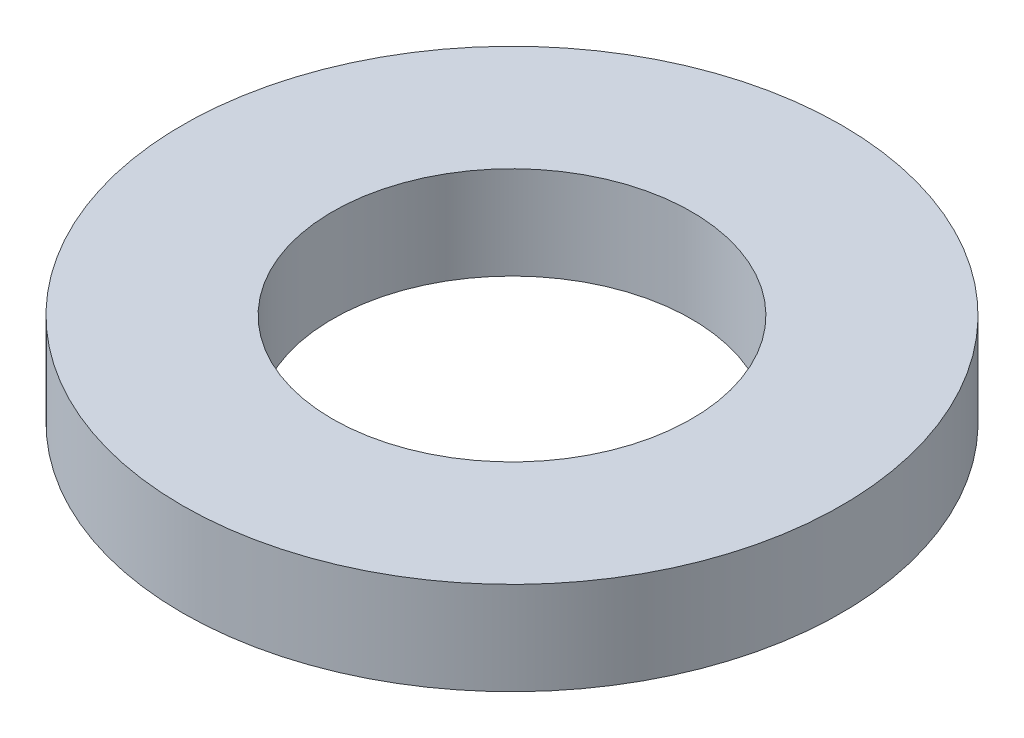
ISO-10303-21;
HEADER;
FILE_DESCRIPTION(('STEP AP214'),'2;1');
FILE_NAME('part.step','',(''),(''),'','','');
FILE_SCHEMA(('AUTOMOTIVE_DESIGN { 1 0 10303 214 1 1 1 1 }'));
ENDSEC;
DATA;
#1=APPLICATION_CONTEXT('core data for automotive mechanical design processes');
#2=APPLICATION_PROTOCOL_DEFINITION('international standard','automotive_design',2000,#1);
#3=PRODUCT_CONTEXT('',#1,'mechanical');
#4=PRODUCT('Part','Part','',(#3));
#5=PRODUCT_RELATED_PRODUCT_CATEGORY('part','',(#4));
#6=PRODUCT_DEFINITION_FORMATION('','',#4);
#7=PRODUCT_DEFINITION_CONTEXT('part definition',#1,'design');
#8=PRODUCT_DEFINITION('design','',#6,#7);
#9=PRODUCT_DEFINITION_SHAPE('','',#8);
#10=(LENGTH_UNIT() NAMED_UNIT(*) SI_UNIT(.MILLI.,.METRE.));
#11=(NAMED_UNIT(*) PLANE_ANGLE_UNIT() SI_UNIT($,.RADIAN.));
#12=(NAMED_UNIT(*) SI_UNIT($,.STERADIAN.) SOLID_ANGLE_UNIT());
#13=UNCERTAINTY_MEASURE_WITH_UNIT(LENGTH_MEASURE(1.E-05),#10,'distance_accuracy_value','');
#14=(GEOMETRIC_REPRESENTATION_CONTEXT(3) GLOBAL_UNCERTAINTY_ASSIGNED_CONTEXT((#13)) GLOBAL_UNIT_ASSIGNED_CONTEXT((#10,
#11,#12)) REPRESENTATION_CONTEXT('',''));
#15=CARTESIAN_POINT('',(0.,0.,0.));
#16=DIRECTION('',(0.,0.,1.));
#17=DIRECTION('',(1.,0.,0.));
#18=AXIS2_PLACEMENT_3D('',#15,#16,#17);
#19=CARTESIAN_POINT('',(0.,1.6764,0.));
#20=DIRECTION('',(0.,-1.,0.));
#21=DIRECTION('',(0.,0.,-1.));
#22=AXIS2_PLACEMENT_3D('',#19,#20,#21);
#23=CYLINDRICAL_SURFACE('',#22,5.9436);
#24=CARTESIAN_POINT('',(0.,1.6764,0.));
#25=DIRECTION('',(0.,1.,0.));
#26=DIRECTION('',(0.,0.,1.));
#27=AXIS2_PLACEMENT_3D('',#24,#25,#26);
#28=CIRCLE('',#27,5.9436);
#29=CARTESIAN_POINT('',(0.,1.6764,5.9436));
#30=VERTEX_POINT('',#29);
#31=EDGE_CURVE('E10',#30,#30,#28,.T.);
#32=ORIENTED_EDGE('',*,*,#31,.F.);
#33=EDGE_LOOP('',(#32));
#34=FACE_BOUND('',#33,.T.);
#35=CARTESIAN_POINT('',(0.,0.,0.));
#36=DIRECTION('',(0.,1.,0.));
#37=DIRECTION('',(0.,0.,1.));
#38=AXIS2_PLACEMENT_3D('',#35,#36,#37);
#39=CIRCLE('',#38,5.9436);
#40=CARTESIAN_POINT('',(0.,0.,5.9436));
#41=VERTEX_POINT('',#40);
#42=EDGE_CURVE('E33',#41,#41,#39,.T.);
#43=ORIENTED_EDGE('',*,*,#42,.T.);
#44=EDGE_LOOP('',(#43));
#45=FACE_BOUND('',#44,.T.);
#46=ADVANCED_FACE('F30',(#34,#45),#23,.T.);
#47=CARTESIAN_POINT('',(0.,1.6764,0.));
#48=DIRECTION('',(0.,1.,0.));
#49=DIRECTION('',(0.,0.,1.));
#50=AXIS2_PLACEMENT_3D('',#47,#48,#49);
#51=PLANE('',#50);
#52=CARTESIAN_POINT('',(0.,1.6764,0.));
#53=DIRECTION('',(0.,1.,0.));
#54=DIRECTION('',(0.,0.,1.));
#55=AXIS2_PLACEMENT_3D('',#52,#53,#54);
#56=CIRCLE('',#55,3.2385);
#57=CARTESIAN_POINT('',(0.,1.6764,3.2385));
#58=VERTEX_POINT('',#57);
#59=EDGE_CURVE('E42',#58,#58,#56,.T.);
#60=ORIENTED_EDGE('',*,*,#59,.F.);
#61=EDGE_LOOP('',(#60));
#62=FACE_BOUND('',#61,.T.);
#63=ORIENTED_EDGE('',*,*,#31,.T.);
#64=EDGE_LOOP('',(#63));
#65=FACE_BOUND('',#64,.T.);
#66=ADVANCED_FACE('F57',(#62,#65),#51,.T.);
#67=CARTESIAN_POINT('',(0.,0.,0.));
#68=DIRECTION('',(0.,1.,0.));
#69=DIRECTION('',(0.,0.,1.));
#70=AXIS2_PLACEMENT_3D('',#67,#68,#69);
#71=PLANE('',#70);
#72=CARTESIAN_POINT('',(0.,0.,0.));
#73=DIRECTION('',(0.,1.,0.));
#74=DIRECTION('',(0.,0.,1.));
#75=AXIS2_PLACEMENT_3D('',#72,#73,#74);
#76=CIRCLE('',#75,3.2385);
#77=CARTESIAN_POINT('',(0.,0.,3.2385));
#78=VERTEX_POINT('',#77);
#79=EDGE_CURVE('E40',#78,#78,#76,.T.);
#80=ORIENTED_EDGE('',*,*,#79,.T.);
#81=EDGE_LOOP('',(#80));
#82=FACE_BOUND('',#81,.T.);
#83=ORIENTED_EDGE('',*,*,#42,.F.);
#84=EDGE_LOOP('',(#83));
#85=FACE_BOUND('',#84,.T.);
#86=ADVANCED_FACE('F48',(#82,#85),#71,.F.);
#87=CARTESIAN_POINT('',(0.,0.,0.));
#88=DIRECTION('',(0.,1.,0.));
#89=DIRECTION('',(0.,0.,1.));
#90=AXIS2_PLACEMENT_3D('',#87,#88,#89);
#91=CYLINDRICAL_SURFACE('',#90,3.2385);
#92=ORIENTED_EDGE('',*,*,#79,.F.);
#93=EDGE_LOOP('',(#92));
#94=FACE_BOUND('',#93,.T.);
#95=ORIENTED_EDGE('',*,*,#59,.T.);
#96=EDGE_LOOP('',(#95));
#97=FACE_BOUND('',#96,.T.);
#98=ADVANCED_FACE('F51',(#94,#97),#91,.F.);
#99=CLOSED_SHELL('',(#46,#66,#86,#98));
#100=MANIFOLD_SOLID_BREP('B2',#99);
#101=ADVANCED_BREP_SHAPE_REPRESENTATION('',(#18,#100),#14);
#102=SHAPE_DEFINITION_REPRESENTATION(#9,#101);
ENDSEC;
END-ISO-10303-21;
